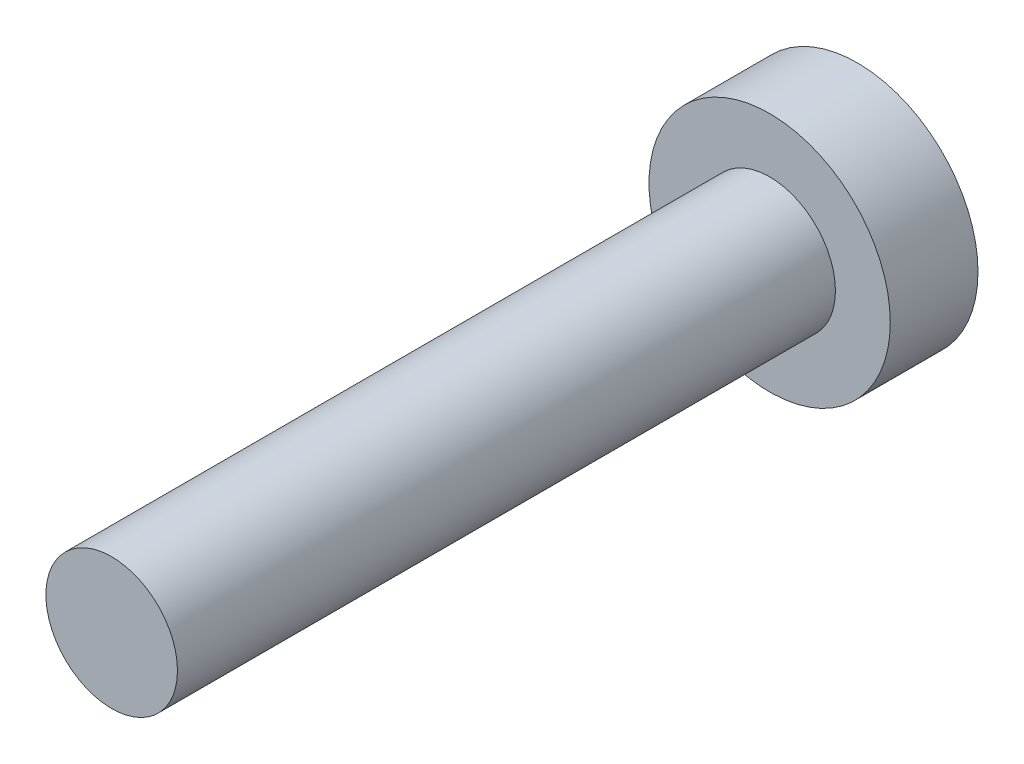
ISO-10303-21;
HEADER;
FILE_DESCRIPTION(('STEP AP214'),'2;1');
FILE_NAME('part.step','',(''),(''),'','','');
FILE_SCHEMA(('AUTOMOTIVE_DESIGN { 1 0 10303 214 1 1 1 1 }'));
ENDSEC;
DATA;
#1=APPLICATION_CONTEXT('core data for automotive mechanical design processes');
#2=APPLICATION_PROTOCOL_DEFINITION('international standard','automotive_design',2000,#1);
#3=PRODUCT_CONTEXT('',#1,'mechanical');
#4=PRODUCT('Part','Part','',(#3));
#5=PRODUCT_RELATED_PRODUCT_CATEGORY('part','',(#4));
#6=PRODUCT_DEFINITION_FORMATION('','',#4);
#7=PRODUCT_DEFINITION_CONTEXT('part definition',#1,'design');
#8=PRODUCT_DEFINITION('design','',#6,#7);
#9=PRODUCT_DEFINITION_SHAPE('','',#8);
#10=(LENGTH_UNIT() NAMED_UNIT(*) SI_UNIT(.MILLI.,.METRE.));
#11=(NAMED_UNIT(*) PLANE_ANGLE_UNIT() SI_UNIT($,.RADIAN.));
#12=(NAMED_UNIT(*) SI_UNIT($,.STERADIAN.) SOLID_ANGLE_UNIT());
#13=UNCERTAINTY_MEASURE_WITH_UNIT(LENGTH_MEASURE(1.E-05),#10,'distance_accuracy_value','');
#14=(GEOMETRIC_REPRESENTATION_CONTEXT(3) GLOBAL_UNCERTAINTY_ASSIGNED_CONTEXT((#13)) GLOBAL_UNIT_ASSIGNED_CONTEXT((#10,
#11,#12)) REPRESENTATION_CONTEXT('',''));
#15=CARTESIAN_POINT('',(0.,0.,0.));
#16=DIRECTION('',(0.,0.,1.));
#17=DIRECTION('',(1.,0.,0.));
#18=AXIS2_PLACEMENT_3D('',#15,#16,#17);
#19=CARTESIAN_POINT('',(0.,0.,2.));
#20=DIRECTION('',(0.,0.,1.));
#21=DIRECTION('',(1.,0.,0.));
#22=AXIS2_PLACEMENT_3D('',#19,#20,#21);
#23=PLANE('',#22);
#24=CARTESIAN_POINT('',(0.,0.,2.));
#25=DIRECTION('',(0.,0.,1.));
#26=DIRECTION('',(1.,0.,0.));
#27=AXIS2_PLACEMENT_3D('',#24,#25,#26);
#28=CIRCLE('',#27,2.75);
#29=CARTESIAN_POINT('',(2.75,0.,2.));
#30=VERTEX_POINT('',#29);
#31=EDGE_CURVE('E10',#30,#30,#28,.T.);
#32=ORIENTED_EDGE('',*,*,#31,.T.);
#33=EDGE_LOOP('',(#32));
#34=FACE_BOUND('',#33,.T.);
#35=CARTESIAN_POINT('',(0.,0.,2.));
#36=DIRECTION('',(0.,0.,1.));
#37=DIRECTION('',(1.,0.,0.));
#38=AXIS2_PLACEMENT_3D('',#35,#36,#37);
#39=CIRCLE('',#38,1.5);
#40=CARTESIAN_POINT('',(1.5,0.,2.));
#41=VERTEX_POINT('',#40);
#42=EDGE_CURVE('E44',#41,#41,#39,.T.);
#43=ORIENTED_EDGE('',*,*,#42,.F.);
#44=EDGE_LOOP('',(#43));
#45=FACE_BOUND('',#44,.T.);
#46=ADVANCED_FACE('F31',(#34,#45),#23,.T.);
#47=CARTESIAN_POINT('',(0.,0.,2.));
#48=DIRECTION('',(0.,0.,-1.));
#49=DIRECTION('',(-1.,0.,0.));
#50=AXIS2_PLACEMENT_3D('',#47,#48,#49);
#51=CYLINDRICAL_SURFACE('',#50,2.75);
#52=ORIENTED_EDGE('',*,*,#31,.F.);
#53=EDGE_LOOP('',(#52));
#54=FACE_BOUND('',#53,.T.);
#55=CARTESIAN_POINT('',(0.,0.,0.));
#56=DIRECTION('',(0.,0.,1.));
#57=DIRECTION('',(1.,0.,0.));
#58=AXIS2_PLACEMENT_3D('',#55,#56,#57);
#59=CIRCLE('',#58,2.75);
#60=CARTESIAN_POINT('',(2.75,0.,0.));
#61=VERTEX_POINT('',#60);
#62=EDGE_CURVE('E35',#61,#61,#59,.T.);
#63=ORIENTED_EDGE('',*,*,#62,.T.);
#64=EDGE_LOOP('',(#63));
#65=FACE_BOUND('',#64,.T.);
#66=ADVANCED_FACE('F33',(#54,#65),#51,.T.);
#67=CARTESIAN_POINT('',(0.,0.,0.));
#68=DIRECTION('',(0.,0.,1.));
#69=DIRECTION('',(1.,0.,0.));
#70=AXIS2_PLACEMENT_3D('',#67,#68,#69);
#71=PLANE('',#70);
#72=ORIENTED_EDGE('',*,*,#62,.F.);
#73=EDGE_LOOP('',(#72));
#74=FACE_BOUND('',#73,.T.);
#75=ADVANCED_FACE('F55',(#74),#71,.F.);
#76=CARTESIAN_POINT('',(0.,0.,17.));
#77=DIRECTION('',(0.,0.,-1.));
#78=DIRECTION('',(-1.,0.,0.));
#79=AXIS2_PLACEMENT_3D('',#76,#77,#78);
#80=CYLINDRICAL_SURFACE('',#79,1.5);
#81=CARTESIAN_POINT('',(0.,0.,17.));
#82=DIRECTION('',(0.,0.,1.));
#83=DIRECTION('',(1.,0.,0.));
#84=AXIS2_PLACEMENT_3D('',#81,#82,#83);
#85=CIRCLE('',#84,1.5);
#86=CARTESIAN_POINT('',(1.5,0.,17.));
#87=VERTEX_POINT('',#86);
#88=EDGE_CURVE('E42',#87,#87,#85,.T.);
#89=ORIENTED_EDGE('',*,*,#88,.F.);
#90=EDGE_LOOP('',(#89));
#91=FACE_BOUND('',#90,.T.);
#92=ORIENTED_EDGE('',*,*,#42,.T.);
#93=EDGE_LOOP('',(#92));
#94=FACE_BOUND('',#93,.T.);
#95=ADVANCED_FACE('F52',(#91,#94),#80,.T.);
#96=CARTESIAN_POINT('',(0.,0.,17.));
#97=DIRECTION('',(0.,0.,1.));
#98=DIRECTION('',(1.,0.,0.));
#99=AXIS2_PLACEMENT_3D('',#96,#97,#98);
#100=PLANE('',#99);
#101=ORIENTED_EDGE('',*,*,#88,.T.);
#102=EDGE_LOOP('',(#101));
#103=FACE_BOUND('',#102,.T.);
#104=ADVANCED_FACE('F50',(#103),#100,.T.);
#105=CLOSED_SHELL('',(#46,#66,#75,#95,#104));
#106=MANIFOLD_SOLID_BREP('B2',#105);
#107=ADVANCED_BREP_SHAPE_REPRESENTATION('',(#18,#106),#14);
#108=SHAPE_DEFINITION_REPRESENTATION(#9,#107);
ENDSEC;
END-ISO-10303-21;
